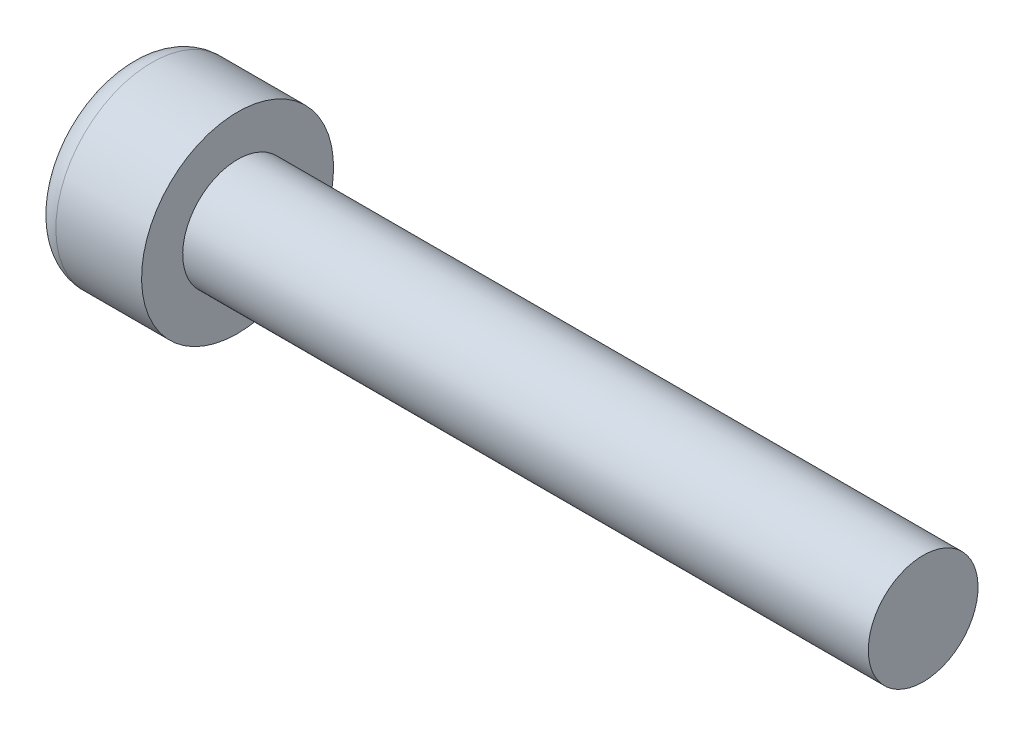
ISO-10303-21;
HEADER;
FILE_DESCRIPTION(('STEP AP214'),'2;1');
FILE_NAME('part.step','',(''),(''),'','','');
FILE_SCHEMA(('AUTOMOTIVE_DESIGN { 1 0 10303 214 1 1 1 1 }'));
ENDSEC;
DATA;
#1=APPLICATION_CONTEXT('core data for automotive mechanical design processes');
#2=APPLICATION_PROTOCOL_DEFINITION('international standard','automotive_design',2000,#1);
#3=PRODUCT_CONTEXT('',#1,'mechanical');
#4=PRODUCT('Part','Part','',(#3));
#5=PRODUCT_RELATED_PRODUCT_CATEGORY('part','',(#4));
#6=PRODUCT_DEFINITION_FORMATION('','',#4);
#7=PRODUCT_DEFINITION_CONTEXT('part definition',#1,'design');
#8=PRODUCT_DEFINITION('design','',#6,#7);
#9=PRODUCT_DEFINITION_SHAPE('','',#8);
#10=(LENGTH_UNIT() NAMED_UNIT(*) SI_UNIT(.MILLI.,.METRE.));
#11=(NAMED_UNIT(*) PLANE_ANGLE_UNIT() SI_UNIT($,.RADIAN.));
#12=(NAMED_UNIT(*) SI_UNIT($,.STERADIAN.) SOLID_ANGLE_UNIT());
#13=UNCERTAINTY_MEASURE_WITH_UNIT(LENGTH_MEASURE(1.E-05),#10,'distance_accuracy_value','');
#14=(GEOMETRIC_REPRESENTATION_CONTEXT(3) GLOBAL_UNCERTAINTY_ASSIGNED_CONTEXT((#13)) GLOBAL_UNIT_ASSIGNED_CONTEXT((#10,
#11,#12)) REPRESENTATION_CONTEXT('',''));
#15=CARTESIAN_POINT('',(0.,0.,0.));
#16=DIRECTION('',(0.,0.,1.));
#17=DIRECTION('',(1.,0.,0.));
#18=AXIS2_PLACEMENT_3D('',#15,#16,#17);
#19=CARTESIAN_POINT('',(0.,0.,0.));
#20=DIRECTION('',(1.,0.,0.));
#21=DIRECTION('',(0.,1.,0.));
#22=AXIS2_PLACEMENT_3D('',#19,#20,#21);
#23=PLANE('',#22);
#24=DIRECTION('',(0.,-0.5,-0.866025403784439));
#25=VECTOR('',#24,1.);
#26=CARTESIAN_POINT('',(0.,1.73205080756888,0.));
#27=LINE('',#26,#25);
#28=CARTESIAN_POINT('',(0.,1.73205080756888,0.));
#29=VERTEX_POINT('',#28);
#30=CARTESIAN_POINT('',(0.,0.866025403784439,-1.5));
#31=VERTEX_POINT('',#30);
#32=EDGE_CURVE('E121',#29,#31,#27,.T.);
#33=ORIENTED_EDGE('',*,*,#32,.F.);
#34=DIRECTION('',(0.,0.5,-0.866025403784439));
#35=VECTOR('',#34,1.);
#36=CARTESIAN_POINT('',(0.,0.866025403784439,1.5));
#37=LINE('',#36,#35);
#38=CARTESIAN_POINT('',(0.,0.866025403784439,1.5));
#39=VERTEX_POINT('',#38);
#40=EDGE_CURVE('E47',#39,#29,#37,.T.);
#41=ORIENTED_EDGE('',*,*,#40,.F.);
#42=DIRECTION('',(0.,1.,0.));
#43=VECTOR('',#42,1.);
#44=CARTESIAN_POINT('',(0.,-0.866025403784439,1.5));
#45=LINE('',#44,#43);
#46=CARTESIAN_POINT('',(0.,-0.866025403784439,1.5));
#47=VERTEX_POINT('',#46);
#48=EDGE_CURVE('E130',#47,#39,#45,.T.);
#49=ORIENTED_EDGE('',*,*,#48,.F.);
#50=DIRECTION('',(0.,0.5,0.866025403784439));
#51=VECTOR('',#50,1.);
#52=CARTESIAN_POINT('',(0.,-1.73205080756888,0.));
#53=LINE('',#52,#51);
#54=CARTESIAN_POINT('',(0.,-1.73205080756888,0.));
#55=VERTEX_POINT('',#54);
#56=EDGE_CURVE('E128',#55,#47,#53,.T.);
#57=ORIENTED_EDGE('',*,*,#56,.F.);
#58=DIRECTION('',(0.,-0.5,0.866025403784439));
#59=VECTOR('',#58,1.);
#60=CARTESIAN_POINT('',(0.,-0.866025403784439,-1.5));
#61=LINE('',#60,#59);
#62=CARTESIAN_POINT('',(0.,-0.866025403784439,-1.5));
#63=VERTEX_POINT('',#62);
#64=EDGE_CURVE('E95',#63,#55,#61,.T.);
#65=ORIENTED_EDGE('',*,*,#64,.F.);
#66=DIRECTION('',(0.,-1.,0.));
#67=VECTOR('',#66,1.);
#68=CARTESIAN_POINT('',(0.,0.866025403784439,-1.5));
#69=LINE('',#68,#67);
#70=EDGE_CURVE('E124',#31,#63,#69,.T.);
#71=ORIENTED_EDGE('',*,*,#70,.F.);
#72=EDGE_LOOP('',(#33,#41,#49,#57,#65,#71));
#73=FACE_BOUND('',#72,.T.);
#74=CARTESIAN_POINT('',(0.,0.,0.));
#75=DIRECTION('',(-1.,0.,0.));
#76=DIRECTION('',(0.,-1.,0.));
#77=AXIS2_PLACEMENT_3D('',#74,#75,#76);
#78=CIRCLE('',#77,2.625);
#79=CARTESIAN_POINT('',(0.,-2.625,0.));
#80=VERTEX_POINT('',#79);
#81=EDGE_CURVE('E11',#80,#80,#78,.T.);
#82=ORIENTED_EDGE('',*,*,#81,.T.);
#83=EDGE_LOOP('',(#82));
#84=FACE_BOUND('',#83,.T.);
#85=ADVANCED_FACE('F33',(#73,#84),#23,.F.);
#86=CARTESIAN_POINT('',(0.875,0.,0.));
#87=DIRECTION('',(-1.,0.,0.));
#88=DIRECTION('',(0.,-1.,0.));
#89=AXIS2_PLACEMENT_3D('',#86,#87,#88);
#90=TOROIDAL_SURFACE('',#89,2.625,0.875);
#91=ORIENTED_EDGE('',*,*,#81,.F.);
#92=EDGE_LOOP('',(#91));
#93=FACE_BOUND('',#92,.T.);
#94=CARTESIAN_POINT('',(0.875,0.,0.));
#95=DIRECTION('',(-1.,0.,0.));
#96=DIRECTION('',(0.,-1.,0.));
#97=AXIS2_PLACEMENT_3D('',#94,#95,#96);
#98=CIRCLE('',#97,3.5);
#99=CARTESIAN_POINT('',(0.875000000000001,-3.5,0.));
#100=VERTEX_POINT('',#99);
#101=EDGE_CURVE('E40',#100,#100,#98,.T.);
#102=ORIENTED_EDGE('',*,*,#101,.T.);
#103=EDGE_LOOP('',(#102));
#104=FACE_BOUND('',#103,.T.);
#105=ADVANCED_FACE('F150',(#93,#104),#90,.T.);
#106=CARTESIAN_POINT('',(0.,0.,0.));
#107=DIRECTION('',(-1.,0.,0.));
#108=DIRECTION('',(0.,-1.,0.));
#109=AXIS2_PLACEMENT_3D('',#106,#107,#108);
#110=CYLINDRICAL_SURFACE('',#109,3.5);
#111=ORIENTED_EDGE('',*,*,#101,.F.);
#112=EDGE_LOOP('',(#111));
#113=FACE_BOUND('',#112,.T.);
#114=CARTESIAN_POINT('',(4.,0.,0.));
#115=DIRECTION('',(-1.,0.,0.));
#116=DIRECTION('',(0.,-1.,0.));
#117=AXIS2_PLACEMENT_3D('',#114,#115,#116);
#118=CIRCLE('',#117,3.5);
#119=CARTESIAN_POINT('',(4.,-3.5,0.));
#120=VERTEX_POINT('',#119);
#121=EDGE_CURVE('E145',#120,#120,#118,.T.);
#122=ORIENTED_EDGE('',*,*,#121,.T.);
#123=EDGE_LOOP('',(#122));
#124=FACE_BOUND('',#123,.T.);
#125=ADVANCED_FACE('F152',(#113,#124),#110,.T.);
#126=CARTESIAN_POINT('',(4.,3.5,0.));
#127=DIRECTION('',(-1.,0.,0.));
#128=DIRECTION('',(0.,-1.,0.));
#129=AXIS2_PLACEMENT_3D('',#126,#127,#128);
#130=PLANE('',#129);
#131=ORIENTED_EDGE('',*,*,#121,.F.);
#132=EDGE_LOOP('',(#131));
#133=FACE_BOUND('',#132,.T.);
#134=CARTESIAN_POINT('',(4.,0.,0.));
#135=DIRECTION('',(-1.,0.,0.));
#136=DIRECTION('',(0.,-1.,0.));
#137=AXIS2_PLACEMENT_3D('',#134,#135,#136);
#138=CIRCLE('',#137,2.);
#139=CARTESIAN_POINT('',(4.,-2.,0.));
#140=VERTEX_POINT('',#139);
#141=EDGE_CURVE('E142',#140,#140,#138,.T.);
#142=ORIENTED_EDGE('',*,*,#141,.T.);
#143=EDGE_LOOP('',(#142));
#144=FACE_BOUND('',#143,.T.);
#145=ADVANCED_FACE('F155',(#133,#144),#130,.F.);
#146=CARTESIAN_POINT('',(0.,0.,0.));
#147=DIRECTION('',(-1.,0.,0.));
#148=DIRECTION('',(0.,-1.,0.));
#149=AXIS2_PLACEMENT_3D('',#146,#147,#148);
#150=CYLINDRICAL_SURFACE('',#149,2.);
#151=ORIENTED_EDGE('',*,*,#141,.F.);
#152=EDGE_LOOP('',(#151));
#153=FACE_BOUND('',#152,.T.);
#154=CARTESIAN_POINT('',(29.,0.,0.));
#155=DIRECTION('',(-1.,0.,0.));
#156=DIRECTION('',(0.,-1.,0.));
#157=AXIS2_PLACEMENT_3D('',#154,#155,#156);
#158=CIRCLE('',#157,1.99999999999999);
#159=CARTESIAN_POINT('',(29.,-1.99999999999999,0.));
#160=VERTEX_POINT('',#159);
#161=EDGE_CURVE('E134',#160,#160,#158,.T.);
#162=ORIENTED_EDGE('',*,*,#161,.T.);
#163=EDGE_LOOP('',(#162));
#164=FACE_BOUND('',#163,.T.);
#165=ADVANCED_FACE('F161',(#153,#164),#150,.T.);
#166=CARTESIAN_POINT('',(29.,2.,0.));
#167=DIRECTION('',(-1.,0.,0.));
#168=DIRECTION('',(0.,-1.,0.));
#169=AXIS2_PLACEMENT_3D('',#166,#167,#168);
#170=PLANE('',#169);
#171=ORIENTED_EDGE('',*,*,#161,.F.);
#172=EDGE_LOOP('',(#171));
#173=FACE_BOUND('',#172,.T.);
#174=ADVANCED_FACE('F167',(#173),#170,.F.);
#175=CARTESIAN_POINT('',(2.,0.866025403784439,1.5));
#176=DIRECTION('',(0.,0.866025403784439,0.5));
#177=DIRECTION('',(0.,-0.5,0.866025403784439));
#178=AXIS2_PLACEMENT_3D('',#175,#176,#177);
#179=PLANE('',#178);
#180=ORIENTED_EDGE('',*,*,#40,.T.);
#181=DIRECTION('',(-1.,0.,0.));
#182=VECTOR('',#181,1.);
#183=CARTESIAN_POINT('',(2.,1.73205080756888,0.));
#184=LINE('',#183,#182);
#185=CARTESIAN_POINT('',(2.,1.73205080756888,0.));
#186=VERTEX_POINT('',#185);
#187=EDGE_CURVE('E77',#186,#29,#184,.T.);
#188=ORIENTED_EDGE('',*,*,#187,.F.);
#189=DIRECTION('',(0.,0.5,-0.866025403784439));
#190=VECTOR('',#189,1.);
#191=CARTESIAN_POINT('',(2.,0.866025403784439,1.5));
#192=LINE('',#191,#190);
#193=CARTESIAN_POINT('',(2.,0.866025403784439,1.5));
#194=VERTEX_POINT('',#193);
#195=EDGE_CURVE('E132',#194,#186,#192,.T.);
#196=ORIENTED_EDGE('',*,*,#195,.F.);
#197=DIRECTION('',(-1.,0.,0.));
#198=VECTOR('',#197,1.);
#199=CARTESIAN_POINT('',(2.,0.866025403784439,1.5));
#200=LINE('',#199,#198);
#201=EDGE_CURVE('E55',#194,#39,#200,.T.);
#202=ORIENTED_EDGE('',*,*,#201,.T.);
#203=EDGE_LOOP('',(#180,#188,#196,#202));
#204=FACE_BOUND('',#203,.T.);
#205=ADVANCED_FACE('F172',(#204),#179,.F.);
#206=CARTESIAN_POINT('',(2.,-0.866025403784439,1.5));
#207=DIRECTION('',(0.,0.,1.));
#208=DIRECTION('',(0.,-1.,0.));
#209=AXIS2_PLACEMENT_3D('',#206,#207,#208);
#210=PLANE('',#209);
#211=ORIENTED_EDGE('',*,*,#48,.T.);
#212=ORIENTED_EDGE('',*,*,#201,.F.);
#213=DIRECTION('',(0.,1.,0.));
#214=VECTOR('',#213,1.);
#215=CARTESIAN_POINT('',(2.,-0.866025403784439,1.5));
#216=LINE('',#215,#214);
#217=CARTESIAN_POINT('',(2.,-0.866025403784439,1.5));
#218=VERTEX_POINT('',#217);
#219=EDGE_CURVE('E107',#218,#194,#216,.T.);
#220=ORIENTED_EDGE('',*,*,#219,.F.);
#221=DIRECTION('',(-1.,0.,0.));
#222=VECTOR('',#221,1.);
#223=CARTESIAN_POINT('',(2.,-0.866025403784439,1.5));
#224=LINE('',#223,#222);
#225=EDGE_CURVE('E99',#218,#47,#224,.T.);
#226=ORIENTED_EDGE('',*,*,#225,.T.);
#227=EDGE_LOOP('',(#211,#212,#220,#226));
#228=FACE_BOUND('',#227,.T.);
#229=ADVANCED_FACE('F177',(#228),#210,.F.);
#230=CARTESIAN_POINT('',(2.,-1.73205080756888,0.));
#231=DIRECTION('',(0.,-0.866025403784439,0.5));
#232=DIRECTION('',(0.,-0.5,-0.866025403784439));
#233=AXIS2_PLACEMENT_3D('',#230,#231,#232);
#234=PLANE('',#233);
#235=ORIENTED_EDGE('',*,*,#56,.T.);
#236=ORIENTED_EDGE('',*,*,#225,.F.);
#237=DIRECTION('',(0.,0.5,0.866025403784439));
#238=VECTOR('',#237,1.);
#239=CARTESIAN_POINT('',(2.,-1.73205080756888,0.));
#240=LINE('',#239,#238);
#241=CARTESIAN_POINT('',(2.,-1.73205080756888,0.));
#242=VERTEX_POINT('',#241);
#243=EDGE_CURVE('E103',#242,#218,#240,.T.);
#244=ORIENTED_EDGE('',*,*,#243,.F.);
#245=DIRECTION('',(-1.,0.,0.));
#246=VECTOR('',#245,1.);
#247=CARTESIAN_POINT('',(2.,-1.73205080756888,0.));
#248=LINE('',#247,#246);
#249=EDGE_CURVE('E88',#242,#55,#248,.T.);
#250=ORIENTED_EDGE('',*,*,#249,.T.);
#251=EDGE_LOOP('',(#235,#236,#244,#250));
#252=FACE_BOUND('',#251,.T.);
#253=ADVANCED_FACE('F104',(#252),#234,.F.);
#254=CARTESIAN_POINT('',(2.,-0.866025403784439,-1.5));
#255=DIRECTION('',(0.,-0.866025403784439,-0.5));
#256=DIRECTION('',(0.,0.5,-0.866025403784439));
#257=AXIS2_PLACEMENT_3D('',#254,#255,#256);
#258=PLANE('',#257);
#259=ORIENTED_EDGE('',*,*,#64,.T.);
#260=ORIENTED_EDGE('',*,*,#249,.F.);
#261=DIRECTION('',(0.,-0.5,0.866025403784439));
#262=VECTOR('',#261,1.);
#263=CARTESIAN_POINT('',(2.,-0.866025403784439,-1.5));
#264=LINE('',#263,#262);
#265=CARTESIAN_POINT('',(2.,-0.866025403784439,-1.5));
#266=VERTEX_POINT('',#265);
#267=EDGE_CURVE('E92',#266,#242,#264,.T.);
#268=ORIENTED_EDGE('',*,*,#267,.F.);
#269=DIRECTION('',(-1.,0.,0.));
#270=VECTOR('',#269,1.);
#271=CARTESIAN_POINT('',(2.,-0.866025403784439,-1.5));
#272=LINE('',#271,#270);
#273=EDGE_CURVE('E100',#266,#63,#272,.T.);
#274=ORIENTED_EDGE('',*,*,#273,.T.);
#275=EDGE_LOOP('',(#259,#260,#268,#274));
#276=FACE_BOUND('',#275,.T.);
#277=ADVANCED_FACE('F90',(#276),#258,.F.);
#278=CARTESIAN_POINT('',(2.,0.866025403784439,-1.5));
#279=DIRECTION('',(0.,0.,-1.));
#280=DIRECTION('',(-1.,0.,0.));
#281=AXIS2_PLACEMENT_3D('',#278,#279,#280);
#282=PLANE('',#281);
#283=ORIENTED_EDGE('',*,*,#70,.T.);
#284=ORIENTED_EDGE('',*,*,#273,.F.);
#285=DIRECTION('',(0.,-1.,0.));
#286=VECTOR('',#285,1.);
#287=CARTESIAN_POINT('',(2.,0.866025403784439,-1.5));
#288=LINE('',#287,#286);
#289=CARTESIAN_POINT('',(2.,0.866025403784439,-1.5));
#290=VERTEX_POINT('',#289);
#291=EDGE_CURVE('E113',#290,#266,#288,.T.);
#292=ORIENTED_EDGE('',*,*,#291,.F.);
#293=DIRECTION('',(-1.,0.,0.));
#294=VECTOR('',#293,1.);
#295=CARTESIAN_POINT('',(2.,0.866025403784439,-1.5));
#296=LINE('',#295,#294);
#297=EDGE_CURVE('E137',#290,#31,#296,.T.);
#298=ORIENTED_EDGE('',*,*,#297,.T.);
#299=EDGE_LOOP('',(#283,#284,#292,#298));
#300=FACE_BOUND('',#299,.T.);
#301=ADVANCED_FACE('F203',(#300),#282,.F.);
#302=CARTESIAN_POINT('',(2.,1.73205080756888,0.));
#303=DIRECTION('',(0.,0.866025403784439,-0.5));
#304=DIRECTION('',(0.,0.5,0.866025403784439));
#305=AXIS2_PLACEMENT_3D('',#302,#303,#304);
#306=PLANE('',#305);
#307=ORIENTED_EDGE('',*,*,#32,.T.);
#308=ORIENTED_EDGE('',*,*,#297,.F.);
#309=DIRECTION('',(0.,-0.5,-0.866025403784439));
#310=VECTOR('',#309,1.);
#311=CARTESIAN_POINT('',(2.,1.73205080756888,0.));
#312=LINE('',#311,#310);
#313=EDGE_CURVE('E115',#186,#290,#312,.T.);
#314=ORIENTED_EDGE('',*,*,#313,.F.);
#315=ORIENTED_EDGE('',*,*,#187,.T.);
#316=EDGE_LOOP('',(#307,#308,#314,#315));
#317=FACE_BOUND('',#316,.T.);
#318=ADVANCED_FACE('F191',(#317),#306,.F.);
#319=CARTESIAN_POINT('',(2.,0.,0.));
#320=DIRECTION('',(-1.,0.,0.));
#321=DIRECTION('',(0.,-1.,0.));
#322=AXIS2_PLACEMENT_3D('',#319,#320,#321);
#323=PLANE('',#322);
#324=ORIENTED_EDGE('',*,*,#195,.T.);
#325=ORIENTED_EDGE('',*,*,#313,.T.);
#326=ORIENTED_EDGE('',*,*,#291,.T.);
#327=ORIENTED_EDGE('',*,*,#267,.T.);
#328=ORIENTED_EDGE('',*,*,#243,.T.);
#329=ORIENTED_EDGE('',*,*,#219,.T.);
#330=EDGE_LOOP('',(#324,#325,#326,#327,#328,#329));
#331=FACE_BOUND('',#330,.T.);
#332=ADVANCED_FACE('F110',(#331),#323,.T.);
#333=CLOSED_SHELL('',(#85,#105,#125,#145,#165,#174,#205,#229,#253,#277,#301,#318,#332));
#334=MANIFOLD_SOLID_BREP('B2',#333);
#335=ADVANCED_BREP_SHAPE_REPRESENTATION('',(#18,#334),#14);
#336=SHAPE_DEFINITION_REPRESENTATION(#9,#335);
ENDSEC;
END-ISO-10303-21;
